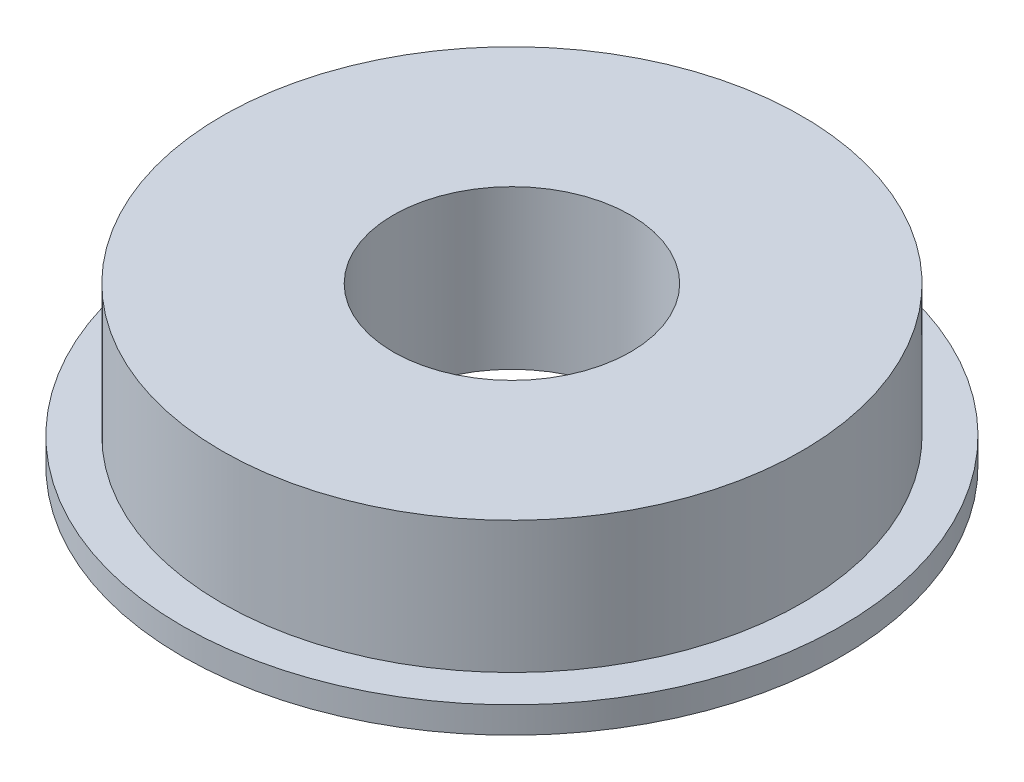
ISO-10303-21;
HEADER;
FILE_DESCRIPTION(('STEP AP214'),'2;1');
FILE_NAME('part.step','',(''),(''),'','','');
FILE_SCHEMA(('AUTOMOTIVE_DESIGN { 1 0 10303 214 1 1 1 1 }'));
ENDSEC;
DATA;
#1=APPLICATION_CONTEXT('core data for automotive mechanical design processes');
#2=APPLICATION_PROTOCOL_DEFINITION('international standard','automotive_design',2000,#1);
#3=PRODUCT_CONTEXT('',#1,'mechanical');
#4=PRODUCT('Part','Part','',(#3));
#5=PRODUCT_RELATED_PRODUCT_CATEGORY('part','',(#4));
#6=PRODUCT_DEFINITION_FORMATION('','',#4);
#7=PRODUCT_DEFINITION_CONTEXT('part definition',#1,'design');
#8=PRODUCT_DEFINITION('design','',#6,#7);
#9=PRODUCT_DEFINITION_SHAPE('','',#8);
#10=(LENGTH_UNIT() NAMED_UNIT(*) SI_UNIT(.MILLI.,.METRE.));
#11=(NAMED_UNIT(*) PLANE_ANGLE_UNIT() SI_UNIT($,.RADIAN.));
#12=(NAMED_UNIT(*) SI_UNIT($,.STERADIAN.) SOLID_ANGLE_UNIT());
#13=UNCERTAINTY_MEASURE_WITH_UNIT(LENGTH_MEASURE(1.E-05),#10,'distance_accuracy_value','');
#14=(GEOMETRIC_REPRESENTATION_CONTEXT(3) GLOBAL_UNCERTAINTY_ASSIGNED_CONTEXT((#13)) GLOBAL_UNIT_ASSIGNED_CONTEXT((#10,
#11,#12)) REPRESENTATION_CONTEXT('',''));
#15=CARTESIAN_POINT('',(0.,0.,0.));
#16=DIRECTION('',(0.,0.,1.));
#17=DIRECTION('',(1.,0.,0.));
#18=AXIS2_PLACEMENT_3D('',#15,#16,#17);
#19=CARTESIAN_POINT('',(0.,1.,0.));
#20=DIRECTION('',(0.,1.,0.));
#21=DIRECTION('',(0.,0.,1.));
#22=AXIS2_PLACEMENT_3D('',#19,#20,#21);
#23=PLANE('',#22);
#24=CARTESIAN_POINT('',(0.,1.,0.));
#25=DIRECTION('',(0.,1.,0.));
#26=DIRECTION('',(0.,0.,1.));
#27=AXIS2_PLACEMENT_3D('',#24,#25,#26);
#28=CIRCLE('',#27,11.);
#29=CARTESIAN_POINT('',(0.,1.,11.));
#30=VERTEX_POINT('',#29);
#31=EDGE_CURVE('E10',#30,#30,#28,.T.);
#32=ORIENTED_EDGE('',*,*,#31,.F.);
#33=EDGE_LOOP('',(#32));
#34=FACE_BOUND('',#33,.T.);
#35=CARTESIAN_POINT('',(0.,1.,0.));
#36=DIRECTION('',(0.,1.,0.));
#37=DIRECTION('',(0.,0.,1.));
#38=AXIS2_PLACEMENT_3D('',#35,#36,#37);
#39=CIRCLE('',#38,12.5);
#40=CARTESIAN_POINT('',(0.,1.,12.5));
#41=VERTEX_POINT('',#40);
#42=EDGE_CURVE('E43',#41,#41,#39,.T.);
#43=ORIENTED_EDGE('',*,*,#42,.T.);
#44=EDGE_LOOP('',(#43));
#45=FACE_BOUND('',#44,.T.);
#46=ADVANCED_FACE('F35',(#34,#45),#23,.T.);
#47=CARTESIAN_POINT('',(0.,0.,0.));
#48=DIRECTION('',(0.,1.,0.));
#49=DIRECTION('',(0.,0.,1.));
#50=AXIS2_PLACEMENT_3D('',#47,#48,#49);
#51=PLANE('',#50);
#52=CARTESIAN_POINT('',(0.,0.,0.));
#53=DIRECTION('',(0.,1.,0.));
#54=DIRECTION('',(0.,0.,1.));
#55=AXIS2_PLACEMENT_3D('',#52,#53,#54);
#56=CIRCLE('',#55,12.5);
#57=CARTESIAN_POINT('',(0.,0.,12.5));
#58=VERTEX_POINT('',#57);
#59=EDGE_CURVE('E39',#58,#58,#56,.T.);
#60=ORIENTED_EDGE('',*,*,#59,.F.);
#61=EDGE_LOOP('',(#60));
#62=FACE_BOUND('',#61,.T.);
#63=CARTESIAN_POINT('',(0.,0.,0.));
#64=DIRECTION('',(0.,1.,0.));
#65=DIRECTION('',(0.,0.,1.));
#66=AXIS2_PLACEMENT_3D('',#63,#64,#65);
#67=CIRCLE('',#66,4.5);
#68=CARTESIAN_POINT('',(0.,0.,4.5));
#69=VERTEX_POINT('',#68);
#70=EDGE_CURVE('E52',#69,#69,#67,.T.);
#71=ORIENTED_EDGE('',*,*,#70,.T.);
#72=EDGE_LOOP('',(#71));
#73=FACE_BOUND('',#72,.T.);
#74=ADVANCED_FACE('F76',(#62,#73),#51,.F.);
#75=CARTESIAN_POINT('',(0.,1.,0.));
#76=DIRECTION('',(0.,-1.,0.));
#77=DIRECTION('',(0.,0.,-1.));
#78=AXIS2_PLACEMENT_3D('',#75,#76,#77);
#79=CYLINDRICAL_SURFACE('',#78,12.5);
#80=ORIENTED_EDGE('',*,*,#42,.F.);
#81=EDGE_LOOP('',(#80));
#82=FACE_BOUND('',#81,.T.);
#83=ORIENTED_EDGE('',*,*,#59,.T.);
#84=EDGE_LOOP('',(#83));
#85=FACE_BOUND('',#84,.T.);
#86=ADVANCED_FACE('F37',(#82,#85),#79,.T.);
#87=CARTESIAN_POINT('',(0.,1.,0.));
#88=DIRECTION('',(0.,-1.,0.));
#89=DIRECTION('',(0.,0.,-1.));
#90=AXIS2_PLACEMENT_3D('',#87,#88,#89);
#91=CYLINDRICAL_SURFACE('',#90,4.5);
#92=ORIENTED_EDGE('',*,*,#70,.F.);
#93=EDGE_LOOP('',(#92));
#94=FACE_BOUND('',#93,.T.);
#95=CARTESIAN_POINT('',(0.,6.,0.));
#96=DIRECTION('',(0.,-1.,0.));
#97=DIRECTION('',(0.,0.,-1.));
#98=AXIS2_PLACEMENT_3D('',#95,#96,#97);
#99=CIRCLE('',#98,4.5);
#100=CARTESIAN_POINT('',(0.,6.,-4.5));
#101=VERTEX_POINT('',#100);
#102=EDGE_CURVE('E58',#101,#101,#99,.T.);
#103=ORIENTED_EDGE('',*,*,#102,.F.);
#104=EDGE_LOOP('',(#103));
#105=FACE_BOUND('',#104,.T.);
#106=ADVANCED_FACE('F66',(#94,#105),#91,.F.);
#107=CARTESIAN_POINT('',(0.,6.,0.));
#108=DIRECTION('',(0.,1.,0.));
#109=DIRECTION('',(0.,0.,1.));
#110=AXIS2_PLACEMENT_3D('',#107,#108,#109);
#111=PLANE('',#110);
#112=ORIENTED_EDGE('',*,*,#102,.T.);
#113=EDGE_LOOP('',(#112));
#114=FACE_BOUND('',#113,.T.);
#115=CARTESIAN_POINT('',(0.,6.,0.));
#116=DIRECTION('',(0.,1.,0.));
#117=DIRECTION('',(0.,0.,1.));
#118=AXIS2_PLACEMENT_3D('',#115,#116,#117);
#119=CIRCLE('',#118,11.);
#120=CARTESIAN_POINT('',(0.,6.,11.));
#121=VERTEX_POINT('',#120);
#122=EDGE_CURVE('E50',#121,#121,#119,.T.);
#123=ORIENTED_EDGE('',*,*,#122,.T.);
#124=EDGE_LOOP('',(#123));
#125=FACE_BOUND('',#124,.T.);
#126=ADVANCED_FACE('F64',(#114,#125),#111,.T.);
#127=CARTESIAN_POINT('',(0.,6.,0.));
#128=DIRECTION('',(0.,-1.,0.));
#129=DIRECTION('',(0.,0.,-1.));
#130=AXIS2_PLACEMENT_3D('',#127,#128,#129);
#131=CYLINDRICAL_SURFACE('',#130,11.);
#132=ORIENTED_EDGE('',*,*,#122,.F.);
#133=EDGE_LOOP('',(#132));
#134=FACE_BOUND('',#133,.T.);
#135=ORIENTED_EDGE('',*,*,#31,.T.);
#136=EDGE_LOOP('',(#135));
#137=FACE_BOUND('',#136,.T.);
#138=ADVANCED_FACE('F74',(#134,#137),#131,.T.);
#139=CLOSED_SHELL('',(#46,#74,#86,#106,#126,#138));
#140=MANIFOLD_SOLID_BREP('B2',#139);
#141=ADVANCED_BREP_SHAPE_REPRESENTATION('',(#18,#140),#14);
#142=SHAPE_DEFINITION_REPRESENTATION(#9,#141);
ENDSEC;
END-ISO-10303-21;
